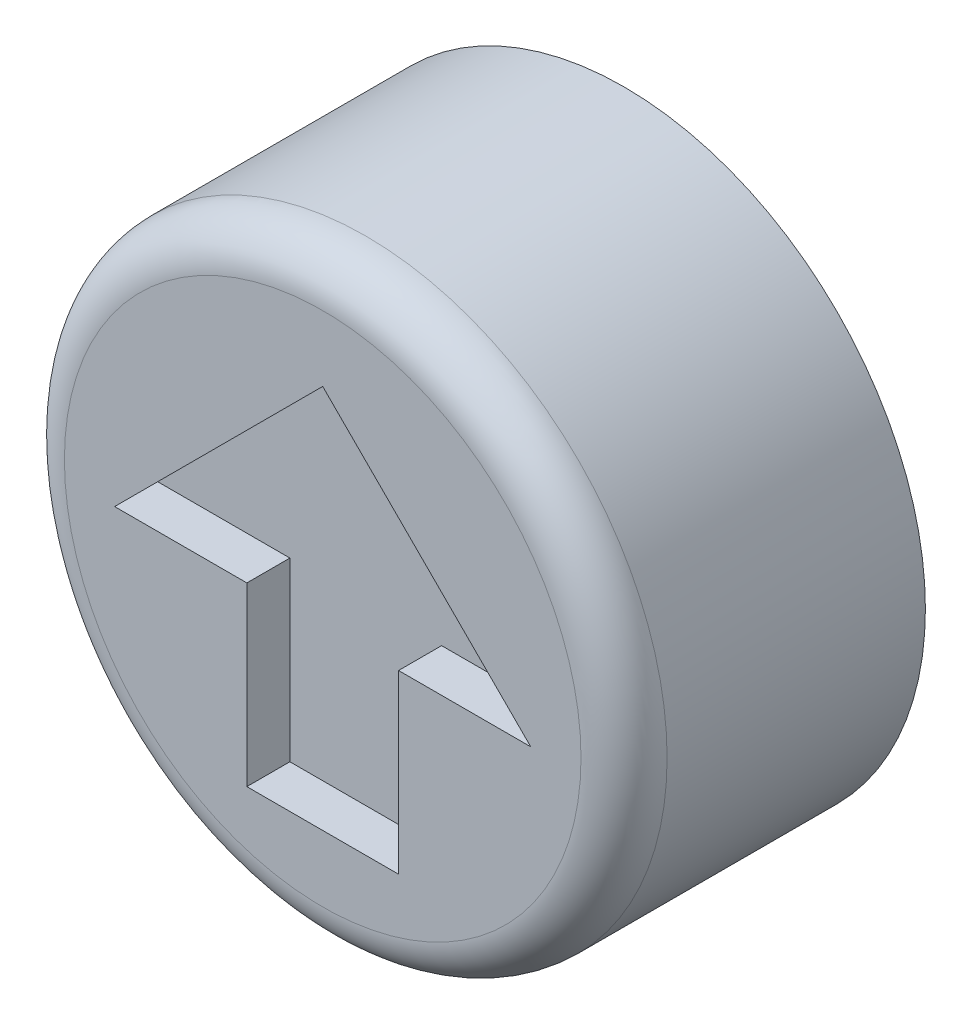
ISO-10303-21;
HEADER;
FILE_DESCRIPTION(('STEP AP214'),'2;1');
FILE_NAME('part.step','',(''),(''),'','','');
FILE_SCHEMA(('AUTOMOTIVE_DESIGN { 1 0 10303 214 1 1 1 1 }'));
ENDSEC;
DATA;
#1=APPLICATION_CONTEXT('core data for automotive mechanical design processes');
#2=APPLICATION_PROTOCOL_DEFINITION('international standard','automotive_design',2000,#1);
#3=PRODUCT_CONTEXT('',#1,'mechanical');
#4=PRODUCT('Part','Part','',(#3));
#5=PRODUCT_RELATED_PRODUCT_CATEGORY('part','',(#4));
#6=PRODUCT_DEFINITION_FORMATION('','',#4);
#7=PRODUCT_DEFINITION_CONTEXT('part definition',#1,'design');
#8=PRODUCT_DEFINITION('design','',#6,#7);
#9=PRODUCT_DEFINITION_SHAPE('','',#8);
#10=(LENGTH_UNIT() NAMED_UNIT(*) SI_UNIT(.MILLI.,.METRE.));
#11=(NAMED_UNIT(*) PLANE_ANGLE_UNIT() SI_UNIT($,.RADIAN.));
#12=(NAMED_UNIT(*) SI_UNIT($,.STERADIAN.) SOLID_ANGLE_UNIT());
#13=UNCERTAINTY_MEASURE_WITH_UNIT(LENGTH_MEASURE(1.E-05),#10,'distance_accuracy_value','');
#14=(GEOMETRIC_REPRESENTATION_CONTEXT(3) GLOBAL_UNCERTAINTY_ASSIGNED_CONTEXT((#13)) GLOBAL_UNIT_ASSIGNED_CONTEXT((#10,
#11,#12)) REPRESENTATION_CONTEXT('',''));
#15=CARTESIAN_POINT('',(0.,0.,0.));
#16=DIRECTION('',(0.,0.,1.));
#17=DIRECTION('',(1.,0.,0.));
#18=AXIS2_PLACEMENT_3D('',#15,#16,#17);
#19=CARTESIAN_POINT('',(0.,0.,0.));
#20=DIRECTION('',(0.,0.,1.));
#21=DIRECTION('',(1.,0.,0.));
#22=AXIS2_PLACEMENT_3D('',#19,#20,#21);
#23=PLANE('',#22);
#24=CARTESIAN_POINT('',(0.,0.,0.));
#25=DIRECTION('',(0.,0.,1.));
#26=DIRECTION('',(1.,0.,0.));
#27=AXIS2_PLACEMENT_3D('',#24,#25,#26);
#28=CIRCLE('',#27,7.);
#29=CARTESIAN_POINT('',(7.,0.,0.));
#30=VERTEX_POINT('',#29);
#31=EDGE_CURVE('E159',#30,#30,#28,.T.);
#32=ORIENTED_EDGE('',*,*,#31,.F.);
#33=EDGE_LOOP('',(#32));
#34=FACE_BOUND('',#33,.T.);
#35=CARTESIAN_POINT('',(0.,0.,0.));
#36=DIRECTION('',(0.,0.,1.));
#37=DIRECTION('',(1.,0.,0.));
#38=AXIS2_PLACEMENT_3D('',#35,#36,#37);
#39=CIRCLE('',#38,1.6);
#40=CARTESIAN_POINT('',(1.6,0.,0.));
#41=VERTEX_POINT('',#40);
#42=EDGE_CURVE('E156',#41,#41,#39,.T.);
#43=ORIENTED_EDGE('',*,*,#42,.T.);
#44=EDGE_LOOP('',(#43));
#45=FACE_BOUND('',#44,.T.);
#46=ADVANCED_FACE('F35',(#34,#45),#23,.F.);
#47=CARTESIAN_POINT('',(0.,0.,5.));
#48=DIRECTION('',(0.,0.,-1.));
#49=DIRECTION('',(-1.,0.,0.));
#50=AXIS2_PLACEMENT_3D('',#47,#48,#49);
#51=CYLINDRICAL_SURFACE('',#50,7.);
#52=CARTESIAN_POINT('',(0.,0.,6.));
#53=DIRECTION('',(0.,0.,1.));
#54=DIRECTION('',(1.,0.,0.));
#55=AXIS2_PLACEMENT_3D('',#52,#53,#54);
#56=CIRCLE('',#55,7.);
#57=CARTESIAN_POINT('',(7.,0.,6.));
#58=VERTEX_POINT('',#57);
#59=EDGE_CURVE('E11',#58,#58,#56,.F.);
#60=ORIENTED_EDGE('',*,*,#59,.T.);
#61=EDGE_LOOP('',(#60));
#62=FACE_BOUND('',#61,.T.);
#63=ORIENTED_EDGE('',*,*,#31,.T.);
#64=EDGE_LOOP('',(#63));
#65=FACE_BOUND('',#64,.T.);
#66=ADVANCED_FACE('F180',(#62,#65),#51,.T.);
#67=CARTESIAN_POINT('',(0.,0.,5.));
#68=DIRECTION('',(0.,0.,-1.));
#69=DIRECTION('',(-1.,0.,0.));
#70=AXIS2_PLACEMENT_3D('',#67,#68,#69);
#71=CYLINDRICAL_SURFACE('',#70,1.6);
#72=CARTESIAN_POINT('',(0.,0.,5.));
#73=DIRECTION('',(0.,0.,1.));
#74=DIRECTION('',(1.,0.,0.));
#75=AXIS2_PLACEMENT_3D('',#72,#73,#74);
#76=CIRCLE('',#75,1.6);
#77=CARTESIAN_POINT('',(1.6,0.,5.));
#78=VERTEX_POINT('',#77);
#79=EDGE_CURVE('E146',#78,#78,#76,.T.);
#80=ORIENTED_EDGE('',*,*,#79,.T.);
#81=EDGE_LOOP('',(#80));
#82=FACE_BOUND('',#81,.T.);
#83=ORIENTED_EDGE('',*,*,#42,.F.);
#84=EDGE_LOOP('',(#83));
#85=FACE_BOUND('',#84,.T.);
#86=ADVANCED_FACE('F186',(#82,#85),#71,.F.);
#87=CARTESIAN_POINT('',(0.,0.,5.));
#88=DIRECTION('',(0.,0.,1.));
#89=DIRECTION('',(1.,0.,0.));
#90=AXIS2_PLACEMENT_3D('',#87,#88,#89);
#91=PLANE('',#90);
#92=ORIENTED_EDGE('',*,*,#79,.F.);
#93=EDGE_LOOP('',(#92));
#94=FACE_BOUND('',#93,.T.);
#95=ADVANCED_FACE('F175',(#94),#91,.F.);
#96=CARTESIAN_POINT('',(0.,0.,7.));
#97=DIRECTION('',(0.,0.,1.));
#98=DIRECTION('',(1.,0.,0.));
#99=AXIS2_PLACEMENT_3D('',#96,#97,#98);
#100=PLANE('',#99);
#101=DIRECTION('',(-0.707106781186544,0.707106781186551,0.));
#102=VECTOR('',#101,1.);
#103=CARTESIAN_POINT('',(0.,4.47290698505753,7.));
#104=LINE('',#103,#102);
#105=CARTESIAN_POINT('',(4.83316504365813,-0.360258058600646,7.));
#106=VERTEX_POINT('',#105);
#107=CARTESIAN_POINT('',(0.,4.47290698505753,7.));
#108=VERTEX_POINT('',#107);
#109=EDGE_CURVE('E50',#106,#108,#104,.T.);
#110=ORIENTED_EDGE('',*,*,#109,.F.);
#111=DIRECTION('',(1.,0.,0.));
#112=VECTOR('',#111,1.);
#113=CARTESIAN_POINT('',(4.83316504365813,-0.360258058600646,7.));
#114=LINE('',#113,#112);
#115=CARTESIAN_POINT('',(1.76205426683781,-0.360258058600646,7.));
#116=VERTEX_POINT('',#115);
#117=EDGE_CURVE('E142',#116,#106,#114,.T.);
#118=ORIENTED_EDGE('',*,*,#117,.F.);
#119=DIRECTION('',(0.,1.,0.));
#120=VECTOR('',#119,1.);
#121=CARTESIAN_POINT('',(1.76205426683781,-0.360258058600646,7.));
#122=LINE('',#121,#120);
#123=CARTESIAN_POINT('',(1.76205426683781,-4.45863933916447,7.));
#124=VERTEX_POINT('',#123);
#125=EDGE_CURVE('E140',#124,#116,#122,.T.);
#126=ORIENTED_EDGE('',*,*,#125,.F.);
#127=DIRECTION('',(1.,0.,0.));
#128=VECTOR('',#127,1.);
#129=CARTESIAN_POINT('',(-1.76205426683781,-4.45863933916447,7.));
#130=LINE('',#129,#128);
#131=CARTESIAN_POINT('',(-1.76205426683781,-4.45863933916447,7.));
#132=VERTEX_POINT('',#131);
#133=EDGE_CURVE('E104',#132,#124,#130,.T.);
#134=ORIENTED_EDGE('',*,*,#133,.F.);
#135=DIRECTION('',(0.,-1.,0.));
#136=VECTOR('',#135,1.);
#137=CARTESIAN_POINT('',(-1.76205426683781,-0.360258058600646,7.));
#138=LINE('',#137,#136);
#139=CARTESIAN_POINT('',(-1.76205426683781,-0.360258058600646,7.));
#140=VERTEX_POINT('',#139);
#141=EDGE_CURVE('E136',#140,#132,#138,.T.);
#142=ORIENTED_EDGE('',*,*,#141,.F.);
#143=DIRECTION('',(1.,0.,0.));
#144=VECTOR('',#143,1.);
#145=CARTESIAN_POINT('',(-4.83316504365813,-0.360258058600646,7.));
#146=LINE('',#145,#144);
#147=CARTESIAN_POINT('',(-4.83316504365813,-0.360258058600646,7.));
#148=VERTEX_POINT('',#147);
#149=EDGE_CURVE('E133',#148,#140,#146,.T.);
#150=ORIENTED_EDGE('',*,*,#149,.F.);
#151=DIRECTION('',(-0.707106781186544,-0.707106781186551,0.));
#152=VECTOR('',#151,1.);
#153=CARTESIAN_POINT('',(0.,4.47290698505753,7.));
#154=LINE('',#153,#152);
#155=EDGE_CURVE('E130',#108,#148,#154,.T.);
#156=ORIENTED_EDGE('',*,*,#155,.F.);
#157=EDGE_LOOP('',(#110,#118,#126,#134,#142,#150,#156));
#158=FACE_BOUND('',#157,.T.);
#159=CARTESIAN_POINT('',(0.,0.,7.));
#160=DIRECTION('',(0.,0.,1.));
#161=DIRECTION('',(1.,0.,0.));
#162=AXIS2_PLACEMENT_3D('',#159,#160,#161);
#163=CIRCLE('',#162,6.);
#164=CARTESIAN_POINT('',(6.,0.,7.));
#165=VERTEX_POINT('',#164);
#166=EDGE_CURVE('E43',#165,#165,#163,.T.);
#167=ORIENTED_EDGE('',*,*,#166,.T.);
#168=EDGE_LOOP('',(#167));
#169=FACE_BOUND('',#168,.T.);
#170=ADVANCED_FACE('F164',(#158,#169),#100,.T.);
#171=CARTESIAN_POINT('',(0.,0.,6.));
#172=DIRECTION('',(0.,0.,1.));
#173=DIRECTION('',(1.,0.,0.));
#174=AXIS2_PLACEMENT_3D('',#171,#172,#173);
#175=TOROIDAL_SURFACE('',#174,6.,1.);
#176=ORIENTED_EDGE('',*,*,#59,.F.);
#177=EDGE_LOOP('',(#176));
#178=FACE_BOUND('',#177,.T.);
#179=ORIENTED_EDGE('',*,*,#166,.F.);
#180=EDGE_LOOP('',(#179));
#181=FACE_BOUND('',#180,.T.);
#182=ADVANCED_FACE('F37',(#178,#181),#175,.T.);
#183=CARTESIAN_POINT('',(0.,4.47290698505753,6.));
#184=DIRECTION('',(0.707106781186551,0.707106781186544,0.));
#185=DIRECTION('',(-0.707106781186544,0.707106781186551,0.));
#186=AXIS2_PLACEMENT_3D('',#183,#184,#185);
#187=PLANE('',#186);
#188=ORIENTED_EDGE('',*,*,#109,.T.);
#189=DIRECTION('',(0.,0.,1.));
#190=VECTOR('',#189,1.);
#191=CARTESIAN_POINT('',(0.,4.47290698505753,6.));
#192=LINE('',#191,#190);
#193=CARTESIAN_POINT('',(0.,4.47290698505753,6.));
#194=VERTEX_POINT('',#193);
#195=EDGE_CURVE('E83',#194,#108,#192,.T.);
#196=ORIENTED_EDGE('',*,*,#195,.F.);
#197=DIRECTION('',(-0.707106781186544,0.707106781186551,0.));
#198=VECTOR('',#197,1.);
#199=CARTESIAN_POINT('',(0.,4.47290698505753,6.));
#200=LINE('',#199,#198);
#201=CARTESIAN_POINT('',(4.83316504365813,-0.360258058600646,6.));
#202=VERTEX_POINT('',#201);
#203=EDGE_CURVE('E144',#202,#194,#200,.T.);
#204=ORIENTED_EDGE('',*,*,#203,.F.);
#205=DIRECTION('',(0.,0.,1.));
#206=VECTOR('',#205,1.);
#207=CARTESIAN_POINT('',(4.83316504365813,-0.360258058600646,6.));
#208=LINE('',#207,#206);
#209=EDGE_CURVE('E58',#202,#106,#208,.T.);
#210=ORIENTED_EDGE('',*,*,#209,.T.);
#211=EDGE_LOOP('',(#188,#196,#204,#210));
#212=FACE_BOUND('',#211,.T.);
#213=ADVANCED_FACE('F167',(#212),#187,.F.);
#214=CARTESIAN_POINT('',(4.83316504365813,-0.360258058600646,6.));
#215=DIRECTION('',(0.,-1.,0.));
#216=DIRECTION('',(0.,0.,-1.));
#217=AXIS2_PLACEMENT_3D('',#214,#215,#216);
#218=PLANE('',#217);
#219=ORIENTED_EDGE('',*,*,#117,.T.);
#220=ORIENTED_EDGE('',*,*,#209,.F.);
#221=DIRECTION('',(1.,0.,0.));
#222=VECTOR('',#221,1.);
#223=CARTESIAN_POINT('',(4.83316504365813,-0.360258058600646,6.));
#224=LINE('',#223,#222);
#225=CARTESIAN_POINT('',(1.76205426683781,-0.360258058600646,6.));
#226=VERTEX_POINT('',#225);
#227=EDGE_CURVE('E116',#226,#202,#224,.T.);
#228=ORIENTED_EDGE('',*,*,#227,.F.);
#229=DIRECTION('',(0.,0.,1.));
#230=VECTOR('',#229,1.);
#231=CARTESIAN_POINT('',(1.76205426683781,-0.360258058600646,6.));
#232=LINE('',#231,#230);
#233=EDGE_CURVE('E108',#226,#116,#232,.T.);
#234=ORIENTED_EDGE('',*,*,#233,.T.);
#235=EDGE_LOOP('',(#219,#220,#228,#234));
#236=FACE_BOUND('',#235,.T.);
#237=ADVANCED_FACE('F173',(#236),#218,.F.);
#238=CARTESIAN_POINT('',(1.76205426683781,-0.360258058600646,6.));
#239=DIRECTION('',(1.,0.,0.));
#240=DIRECTION('',(0.,0.,-1.));
#241=AXIS2_PLACEMENT_3D('',#238,#239,#240);
#242=PLANE('',#241);
#243=ORIENTED_EDGE('',*,*,#125,.T.);
#244=ORIENTED_EDGE('',*,*,#233,.F.);
#245=DIRECTION('',(0.,1.,0.));
#246=VECTOR('',#245,1.);
#247=CARTESIAN_POINT('',(1.76205426683781,-0.360258058600646,6.));
#248=LINE('',#247,#246);
#249=CARTESIAN_POINT('',(1.76205426683781,-4.45863933916447,6.));
#250=VERTEX_POINT('',#249);
#251=EDGE_CURVE('E112',#250,#226,#248,.T.);
#252=ORIENTED_EDGE('',*,*,#251,.F.);
#253=DIRECTION('',(0.,0.,1.));
#254=VECTOR('',#253,1.);
#255=CARTESIAN_POINT('',(1.76205426683781,-4.45863933916447,6.));
#256=LINE('',#255,#254);
#257=EDGE_CURVE('E97',#250,#124,#256,.T.);
#258=ORIENTED_EDGE('',*,*,#257,.T.);
#259=EDGE_LOOP('',(#243,#244,#252,#258));
#260=FACE_BOUND('',#259,.T.);
#261=ADVANCED_FACE('F113',(#260),#242,.F.);
#262=CARTESIAN_POINT('',(-1.76205426683781,-4.45863933916447,6.));
#263=DIRECTION('',(0.,-1.,0.));
#264=DIRECTION('',(0.,0.,-1.));
#265=AXIS2_PLACEMENT_3D('',#262,#263,#264);
#266=PLANE('',#265);
#267=ORIENTED_EDGE('',*,*,#133,.T.);
#268=ORIENTED_EDGE('',*,*,#257,.F.);
#269=DIRECTION('',(1.,0.,0.));
#270=VECTOR('',#269,1.);
#271=CARTESIAN_POINT('',(-1.76205426683781,-4.45863933916447,6.));
#272=LINE('',#271,#270);
#273=CARTESIAN_POINT('',(-1.76205426683781,-4.45863933916447,6.));
#274=VERTEX_POINT('',#273);
#275=EDGE_CURVE('E101',#274,#250,#272,.T.);
#276=ORIENTED_EDGE('',*,*,#275,.F.);
#277=DIRECTION('',(0.,0.,1.));
#278=VECTOR('',#277,1.);
#279=CARTESIAN_POINT('',(-1.76205426683781,-4.45863933916447,6.));
#280=LINE('',#279,#278);
#281=EDGE_CURVE('E109',#274,#132,#280,.T.);
#282=ORIENTED_EDGE('',*,*,#281,.T.);
#283=EDGE_LOOP('',(#267,#268,#276,#282));
#284=FACE_BOUND('',#283,.T.);
#285=ADVANCED_FACE('F99',(#284),#266,.F.);
#286=CARTESIAN_POINT('',(-1.76205426683781,-0.360258058600646,6.));
#287=DIRECTION('',(-1.,0.,0.));
#288=DIRECTION('',(0.,0.,1.));
#289=AXIS2_PLACEMENT_3D('',#286,#287,#288);
#290=PLANE('',#289);
#291=ORIENTED_EDGE('',*,*,#141,.T.);
#292=ORIENTED_EDGE('',*,*,#281,.F.);
#293=DIRECTION('',(0.,-1.,0.));
#294=VECTOR('',#293,1.);
#295=CARTESIAN_POINT('',(-1.76205426683781,-0.360258058600646,6.));
#296=LINE('',#295,#294);
#297=CARTESIAN_POINT('',(-1.76205426683781,-0.360258058600646,6.));
#298=VERTEX_POINT('',#297);
#299=EDGE_CURVE('E122',#298,#274,#296,.T.);
#300=ORIENTED_EDGE('',*,*,#299,.F.);
#301=DIRECTION('',(0.,0.,1.));
#302=VECTOR('',#301,1.);
#303=CARTESIAN_POINT('',(-1.76205426683781,-0.360258058600646,6.));
#304=LINE('',#303,#302);
#305=EDGE_CURVE('E149',#298,#140,#304,.T.);
#306=ORIENTED_EDGE('',*,*,#305,.T.);
#307=EDGE_LOOP('',(#291,#292,#300,#306));
#308=FACE_BOUND('',#307,.T.);
#309=ADVANCED_FACE('F204',(#308),#290,.F.);
#310=CARTESIAN_POINT('',(-4.83316504365813,-0.360258058600646,6.));
#311=DIRECTION('',(0.,-1.,0.));
#312=DIRECTION('',(0.,0.,-1.));
#313=AXIS2_PLACEMENT_3D('',#310,#311,#312);
#314=PLANE('',#313);
#315=ORIENTED_EDGE('',*,*,#149,.T.);
#316=ORIENTED_EDGE('',*,*,#305,.F.);
#317=DIRECTION('',(1.,0.,0.));
#318=VECTOR('',#317,1.);
#319=CARTESIAN_POINT('',(-4.83316504365813,-0.360258058600646,6.));
#320=LINE('',#319,#318);
#321=CARTESIAN_POINT('',(-4.83316504365813,-0.360258058600646,6.));
#322=VERTEX_POINT('',#321);
#323=EDGE_CURVE('E124',#322,#298,#320,.T.);
#324=ORIENTED_EDGE('',*,*,#323,.F.);
#325=DIRECTION('',(0.,0.,1.));
#326=VECTOR('',#325,1.);
#327=CARTESIAN_POINT('',(-4.83316504365813,-0.360258058600646,6.));
#328=LINE('',#327,#326);
#329=EDGE_CURVE('E151',#322,#148,#328,.T.);
#330=ORIENTED_EDGE('',*,*,#329,.T.);
#331=EDGE_LOOP('',(#315,#316,#324,#330));
#332=FACE_BOUND('',#331,.T.);
#333=ADVANCED_FACE('F200',(#332),#314,.F.);
#334=CARTESIAN_POINT('',(0.,4.47290698505753,6.));
#335=DIRECTION('',(-0.707106781186551,0.707106781186544,0.));
#336=DIRECTION('',(-0.707106781186544,-0.707106781186551,0.));
#337=AXIS2_PLACEMENT_3D('',#334,#335,#336);
#338=PLANE('',#337);
#339=ORIENTED_EDGE('',*,*,#155,.T.);
#340=ORIENTED_EDGE('',*,*,#329,.F.);
#341=DIRECTION('',(-0.707106781186544,-0.707106781186551,0.));
#342=VECTOR('',#341,1.);
#343=CARTESIAN_POINT('',(0.,4.47290698505753,6.));
#344=LINE('',#343,#342);
#345=EDGE_CURVE('E305',#194,#322,#344,.T.);
#346=ORIENTED_EDGE('',*,*,#345,.F.);
#347=ORIENTED_EDGE('',*,*,#195,.T.);
#348=EDGE_LOOP('',(#339,#340,#346,#347));
#349=FACE_BOUND('',#348,.T.);
#350=ADVANCED_FACE('F197',(#349),#338,.F.);
#351=CARTESIAN_POINT('',(0.,0.,6.));
#352=DIRECTION('',(0.,0.,-1.));
#353=DIRECTION('',(-1.,0.,0.));
#354=AXIS2_PLACEMENT_3D('',#351,#352,#353);
#355=PLANE('',#354);
#356=ORIENTED_EDGE('',*,*,#203,.T.);
#357=ORIENTED_EDGE('',*,*,#345,.T.);
#358=ORIENTED_EDGE('',*,*,#323,.T.);
#359=ORIENTED_EDGE('',*,*,#299,.T.);
#360=ORIENTED_EDGE('',*,*,#275,.T.);
#361=ORIENTED_EDGE('',*,*,#251,.T.);
#362=ORIENTED_EDGE('',*,*,#227,.T.);
#363=EDGE_LOOP('',(#356,#357,#358,#359,#360,#361,#362));
#364=FACE_BOUND('',#363,.T.);
#365=ADVANCED_FACE('F119',(#364),#355,.F.);
#366=CLOSED_SHELL('',(#46,#66,#86,#95,#170,#182,#213,#237,#261,#285,#309,#333,#350,#365));
#367=MANIFOLD_SOLID_BREP('B2',#366);
#368=ADVANCED_BREP_SHAPE_REPRESENTATION('',(#18,#367),#14);
#369=SHAPE_DEFINITION_REPRESENTATION(#9,#368);
ENDSEC;
END-ISO-10303-21;
